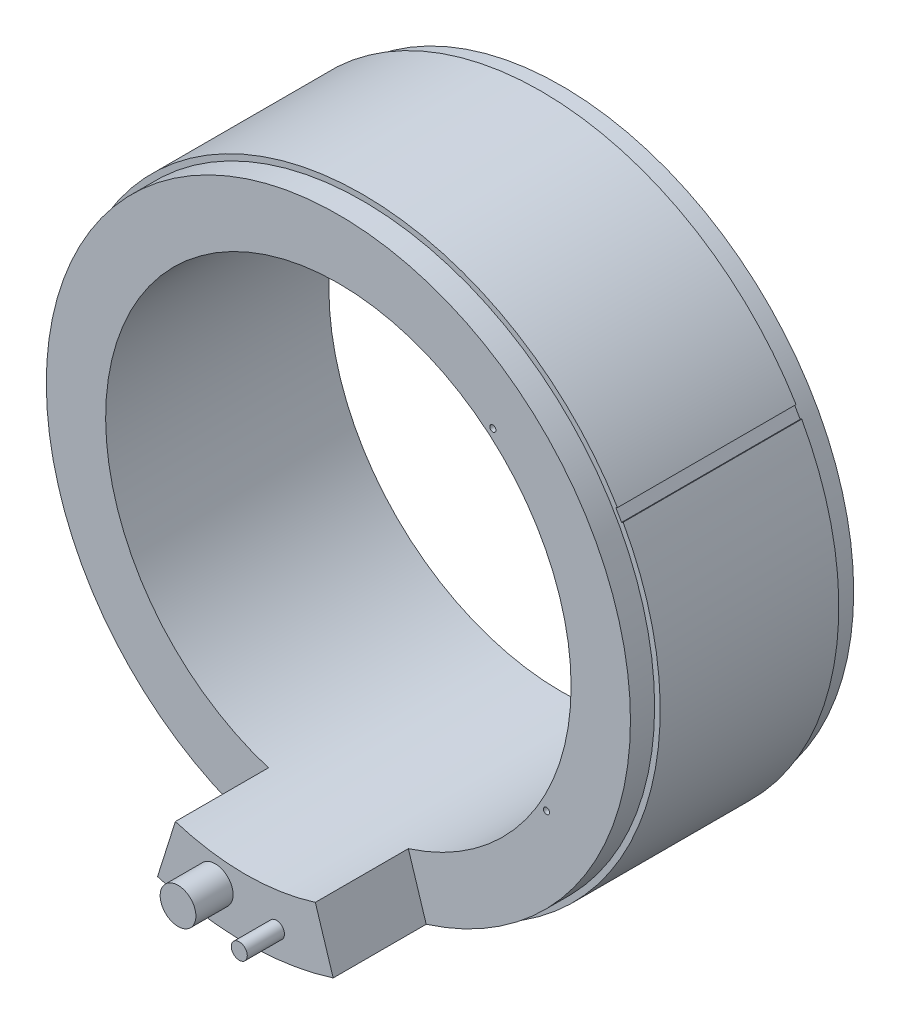
ISO-10303-21;
HEADER;
FILE_DESCRIPTION(('STEP AP214'),'2;1');
FILE_NAME('part.step','',(''),(''),'','','');
FILE_SCHEMA(('AUTOMOTIVE_DESIGN { 1 0 10303 214 1 1 1 1 }'));
ENDSEC;
DATA;
#1=APPLICATION_CONTEXT('core data for automotive mechanical design processes');
#2=APPLICATION_PROTOCOL_DEFINITION('international standard','automotive_design',2000,#1);
#3=PRODUCT_CONTEXT('',#1,'mechanical');
#4=PRODUCT('Part','Part','',(#3));
#5=PRODUCT_RELATED_PRODUCT_CATEGORY('part','',(#4));
#6=PRODUCT_DEFINITION_FORMATION('','',#4);
#7=PRODUCT_DEFINITION_CONTEXT('part definition',#1,'design');
#8=PRODUCT_DEFINITION('design','',#6,#7);
#9=PRODUCT_DEFINITION_SHAPE('','',#8);
#10=(LENGTH_UNIT() NAMED_UNIT(*) SI_UNIT(.MILLI.,.METRE.));
#11=(NAMED_UNIT(*) PLANE_ANGLE_UNIT() SI_UNIT($,.RADIAN.));
#12=(NAMED_UNIT(*) SI_UNIT($,.STERADIAN.) SOLID_ANGLE_UNIT());
#13=UNCERTAINTY_MEASURE_WITH_UNIT(LENGTH_MEASURE(1.E-05),#10,'distance_accuracy_value','');
#14=(GEOMETRIC_REPRESENTATION_CONTEXT(3) GLOBAL_UNCERTAINTY_ASSIGNED_CONTEXT((#13)) GLOBAL_UNIT_ASSIGNED_CONTEXT((#10,
#11,#12)) REPRESENTATION_CONTEXT('',''));
#15=CARTESIAN_POINT('',(0.,0.,0.));
#16=DIRECTION('',(0.,0.,1.));
#17=DIRECTION('',(1.,0.,0.));
#18=AXIS2_PLACEMENT_3D('',#15,#16,#17);
#19=CARTESIAN_POINT('',(-8.09694915469374,-68.9260430779709,164.));
#20=DIRECTION('',(0.,0.,-1.));
#21=DIRECTION('',(-1.,0.,0.));
#22=AXIS2_PLACEMENT_3D('',#19,#20,#21);
#23=CYLINDRICAL_SURFACE('',#22,4.8);
#24=CARTESIAN_POINT('',(-8.09694915469374,-68.9260430779709,85.));
#25=DIRECTION('',(0.,0.,-1.));
#26=DIRECTION('',(-1.,0.,0.));
#27=AXIS2_PLACEMENT_3D('',#24,#25,#26);
#28=CIRCLE('',#27,4.8);
#29=CARTESIAN_POINT('',(-12.8969491546937,-68.9260430779709,85.));
#30=VERTEX_POINT('',#29);
#31=EDGE_CURVE('E452',#30,#30,#28,.T.);
#32=ORIENTED_EDGE('',*,*,#31,.F.);
#33=EDGE_LOOP('',(#32));
#34=FACE_BOUND('',#33,.T.);
#35=CARTESIAN_POINT('',(-8.09694915469374,-68.9260430779709,95.));
#36=DIRECTION('',(0.,0.,1.));
#37=DIRECTION('',(1.,0.,0.));
#38=AXIS2_PLACEMENT_3D('',#35,#36,#37);
#39=CIRCLE('',#38,4.80000000000001);
#40=CARTESIAN_POINT('',(-3.29694915469373,-68.9260430779709,95.));
#41=VERTEX_POINT('',#40);
#42=EDGE_CURVE('E878',#41,#41,#39,.T.);
#43=ORIENTED_EDGE('',*,*,#42,.F.);
#44=EDGE_LOOP('',(#43));
#45=FACE_BOUND('',#44,.T.);
#46=ADVANCED_FACE('F64',(#34,#45),#23,.T.);
#47=CARTESIAN_POINT('',(8.36529185002222,-71.2103355719094,164.));
#48=DIRECTION('',(0.,0.,-1.));
#49=DIRECTION('',(-1.,0.,0.));
#50=AXIS2_PLACEMENT_3D('',#47,#48,#49);
#51=CYLINDRICAL_SURFACE('',#50,2.15);
#52=CARTESIAN_POINT('',(8.36529185002222,-71.2103355719094,85.));
#53=DIRECTION('',(0.,0.,-1.));
#54=DIRECTION('',(-1.,0.,0.));
#55=AXIS2_PLACEMENT_3D('',#52,#53,#54);
#56=CIRCLE('',#55,2.15);
#57=CARTESIAN_POINT('',(6.21529185002222,-71.2103355719094,85.));
#58=VERTEX_POINT('',#57);
#59=EDGE_CURVE('E448',#58,#58,#56,.T.);
#60=ORIENTED_EDGE('',*,*,#59,.F.);
#61=EDGE_LOOP('',(#60));
#62=FACE_BOUND('',#61,.T.);
#63=CARTESIAN_POINT('',(8.36529185002222,-71.2103355719094,95.));
#64=DIRECTION('',(0.,0.,1.));
#65=DIRECTION('',(1.,0.,0.));
#66=AXIS2_PLACEMENT_3D('',#63,#64,#65);
#67=CIRCLE('',#66,2.14999999999999);
#68=CARTESIAN_POINT('',(10.5152918500222,-71.2103355719094,95.));
#69=VERTEX_POINT('',#68);
#70=EDGE_CURVE('E495',#69,#69,#67,.T.);
#71=ORIENTED_EDGE('',*,*,#70,.F.);
#72=EDGE_LOOP('',(#71));
#73=FACE_BOUND('',#72,.T.);
#74=ADVANCED_FACE('F536',(#62,#73),#51,.T.);
#75=CARTESIAN_POINT('',(41.5240795857504,49.486471025486,54.));
#76=DIRECTION('',(0.,0.,1.));
#77=DIRECTION('',(0.,1.,0.));
#78=AXIS2_PLACEMENT_3D('',#75,#76,#77);
#79=CONICAL_SURFACE('',#78,0.825,1.02974425867665);
#80=CARTESIAN_POINT('',(41.5240795857504,49.486471025486,53.5042899893023));
#81=VERTEX_POINT('',#80);
#82=VERTEX_LOOP('',#81);
#83=FACE_BOUND('',#82,.T.);
#84=CARTESIAN_POINT('',(41.5240795857504,49.486471025486,54.));
#85=DIRECTION('',(0.,0.,-1.));
#86=DIRECTION('',(0.,1.,0.));
#87=AXIS2_PLACEMENT_3D('',#84,#85,#86);
#88=CIRCLE('',#87,0.825);
#89=CARTESIAN_POINT('',(41.5240795857504,50.311471025486,54.));
#90=VERTEX_POINT('',#89);
#91=EDGE_CURVE('E11',#90,#90,#88,.T.);
#92=ORIENTED_EDGE('',*,*,#91,.F.);
#93=EDGE_LOOP('',(#92));
#94=FACE_BOUND('',#93,.T.);
#95=ADVANCED_FACE('F66',(#83,#94),#79,.F.);
#96=CARTESIAN_POINT('',(41.5240795857504,49.486471025486,60.));
#97=DIRECTION('',(0.,0.,-1.));
#98=DIRECTION('',(0.,-1.,0.));
#99=AXIS2_PLACEMENT_3D('',#96,#97,#98);
#100=CYLINDRICAL_SURFACE('',#99,0.825);
#101=CARTESIAN_POINT('',(41.5240795857504,49.486471025486,60.));
#102=DIRECTION('',(0.,0.,-1.));
#103=DIRECTION('',(0.,-1.,0.));
#104=AXIS2_PLACEMENT_3D('',#101,#102,#103);
#105=CIRCLE('',#104,0.825);
#106=CARTESIAN_POINT('',(41.5240795857504,48.661471025486,60.));
#107=VERTEX_POINT('',#106);
#108=EDGE_CURVE('E357',#107,#107,#105,.T.);
#109=ORIENTED_EDGE('',*,*,#108,.F.);
#110=EDGE_LOOP('',(#109));
#111=FACE_BOUND('',#110,.T.);
#112=ORIENTED_EDGE('',*,*,#91,.T.);
#113=EDGE_LOOP('',(#112));
#114=FACE_BOUND('',#113,.T.);
#115=ADVANCED_FACE('F262',(#111,#114),#100,.F.);
#116=CARTESIAN_POINT('',(55.9452410844747,-32.3,54.));
#117=DIRECTION('',(0.,0.,1.));
#118=DIRECTION('',(0.,1.,0.));
#119=AXIS2_PLACEMENT_3D('',#116,#117,#118);
#120=CONICAL_SURFACE('',#119,0.825,1.02974425867665);
#121=CARTESIAN_POINT('',(55.9452410844747,-32.3,53.5042899893023));
#122=VERTEX_POINT('',#121);
#123=VERTEX_LOOP('',#122);
#124=FACE_BOUND('',#123,.T.);
#125=CARTESIAN_POINT('',(55.9452410844747,-32.3,54.));
#126=DIRECTION('',(0.,0.,-1.));
#127=DIRECTION('',(0.,1.,0.));
#128=AXIS2_PLACEMENT_3D('',#125,#126,#127);
#129=CIRCLE('',#128,0.825);
#130=CARTESIAN_POINT('',(55.9452410844747,-31.475,54.));
#131=VERTEX_POINT('',#130);
#132=EDGE_CURVE('E68',#131,#131,#129,.T.);
#133=ORIENTED_EDGE('',*,*,#132,.F.);
#134=EDGE_LOOP('',(#133));
#135=FACE_BOUND('',#134,.T.);
#136=ADVANCED_FACE('F258',(#124,#135),#120,.F.);
#137=CARTESIAN_POINT('',(55.9452410844747,-32.3,60.));
#138=DIRECTION('',(0.,0.,-1.));
#139=DIRECTION('',(0.,-1.,0.));
#140=AXIS2_PLACEMENT_3D('',#137,#138,#139);
#141=CYLINDRICAL_SURFACE('',#140,0.825);
#142=CARTESIAN_POINT('',(55.9452410844747,-32.3,60.));
#143=DIRECTION('',(0.,0.,-1.));
#144=DIRECTION('',(0.,-1.,0.));
#145=AXIS2_PLACEMENT_3D('',#142,#143,#144);
#146=CIRCLE('',#145,0.825);
#147=CARTESIAN_POINT('',(55.9452410844747,-33.125,60.));
#148=VERTEX_POINT('',#147);
#149=EDGE_CURVE('E394',#148,#148,#146,.T.);
#150=ORIENTED_EDGE('',*,*,#149,.F.);
#151=EDGE_LOOP('',(#150));
#152=FACE_BOUND('',#151,.T.);
#153=ORIENTED_EDGE('',*,*,#132,.T.);
#154=EDGE_LOOP('',(#153));
#155=FACE_BOUND('',#154,.T.);
#156=ADVANCED_FACE('F261',(#152,#155),#141,.F.);
#157=CARTESIAN_POINT('',(68.0865196008629,41.0706887407713,-188.203026023034));
#158=DIRECTION('',(0.5,-0.866025403784439,0.));
#159=DIRECTION('',(0.,0.,-1.));
#160=AXIS2_PLACEMENT_3D('',#157,#158,#159);
#161=PLANE('',#160);
#162=DIRECTION('',(0.,0.,1.));
#163=VECTOR('',#162,1.);
#164=CARTESIAN_POINT('',(68.5069433444502,41.3134205023052,-188.203026023034));
#165=LINE('',#164,#163);
#166=CARTESIAN_POINT('',(68.5069433444502,41.3134205023052,5.5));
#167=VERTEX_POINT('',#166);
#168=CARTESIAN_POINT('',(68.5069433444502,41.3134205023052,53.5));
#169=VERTEX_POINT('',#168);
#170=EDGE_CURVE('E364',#167,#169,#165,.T.);
#171=ORIENTED_EDGE('',*,*,#170,.T.);
#172=DIRECTION('',(0.866025403784439,0.5,0.));
#173=VECTOR('',#172,1.);
#174=CARTESIAN_POINT('',(68.0865196008629,41.0706887407713,53.5));
#175=LINE('',#174,#173);
#176=CARTESIAN_POINT('',(68.0865196008629,41.0706887407713,53.5));
#177=VERTEX_POINT('',#176);
#178=EDGE_CURVE('E328',#177,#169,#175,.T.);
#179=ORIENTED_EDGE('',*,*,#178,.F.);
#180=DIRECTION('',(0.,0.,1.));
#181=VECTOR('',#180,1.);
#182=CARTESIAN_POINT('',(68.0865196008629,41.0706887407713,-188.203026023034));
#183=LINE('',#182,#181);
#184=CARTESIAN_POINT('',(68.0865196008629,41.0706887407713,5.5));
#185=VERTEX_POINT('',#184);
#186=EDGE_CURVE('E264',#185,#177,#183,.T.);
#187=ORIENTED_EDGE('',*,*,#186,.F.);
#188=DIRECTION('',(-0.866025403784439,-0.5,0.));
#189=VECTOR('',#188,1.);
#190=CARTESIAN_POINT('',(59.2375,35.9617048921489,5.5));
#191=LINE('',#190,#189);
#192=EDGE_CURVE('E415',#167,#185,#191,.T.);
#193=ORIENTED_EDGE('',*,*,#192,.F.);
#194=EDGE_LOOP('',(#171,#179,#187,#193));
#195=FACE_BOUND('',#194,.T.);
#196=ADVANCED_FACE('F516',(#195),#161,.T.);
#197=CARTESIAN_POINT('',(69.6115196008629,38.4293112592288,-188.203026023034));
#198=DIRECTION('',(0.866025403784438,0.5,0.));
#199=DIRECTION('',(0.,0.,-1.));
#200=AXIS2_PLACEMENT_3D('',#197,#198,#199);
#201=PLANE('',#200);
#202=ORIENTED_EDGE('',*,*,#186,.T.);
#203=DIRECTION('',(-0.5,0.866025403784438,0.));
#204=VECTOR('',#203,1.);
#205=CARTESIAN_POINT('',(69.6115196008629,38.4293112592288,53.5));
#206=LINE('',#205,#204);
#207=CARTESIAN_POINT('',(69.6115196008629,38.4293112592288,53.5));
#208=VERTEX_POINT('',#207);
#209=EDGE_CURVE('E331',#208,#177,#206,.T.);
#210=ORIENTED_EDGE('',*,*,#209,.F.);
#211=DIRECTION('',(0.,0.,1.));
#212=VECTOR('',#211,1.);
#213=CARTESIAN_POINT('',(69.6115196008629,38.4293112592288,-188.203026023034));
#214=LINE('',#213,#212);
#215=CARTESIAN_POINT('',(69.6115196008629,38.4293112592288,5.5));
#216=VERTEX_POINT('',#215);
#217=EDGE_CURVE('E269',#216,#208,#214,.T.);
#218=ORIENTED_EDGE('',*,*,#217,.F.);
#219=DIRECTION('',(0.5,-0.866025403784438,0.));
#220=VECTOR('',#219,1.);
#221=CARTESIAN_POINT('',(88.8490196008629,5.10898384862248,5.5));
#222=LINE('',#221,#220);
#223=EDGE_CURVE('E377',#185,#216,#222,.T.);
#224=ORIENTED_EDGE('',*,*,#223,.F.);
#225=EDGE_LOOP('',(#202,#210,#218,#224));
#226=FACE_BOUND('',#225,.T.);
#227=ADVANCED_FACE('F507',(#226),#201,.T.);
#228=CARTESIAN_POINT('',(70.0319433444502,38.6720430207627,-188.203026023034));
#229=DIRECTION('',(-0.5,0.866025403784438,0.));
#230=DIRECTION('',(0.,0.,1.));
#231=AXIS2_PLACEMENT_3D('',#228,#229,#230);
#232=PLANE('',#231);
#233=ORIENTED_EDGE('',*,*,#217,.T.);
#234=DIRECTION('',(-0.866025403784438,-0.5,0.));
#235=VECTOR('',#234,1.);
#236=CARTESIAN_POINT('',(70.0319433444502,38.6720430207627,53.5));
#237=LINE('',#236,#235);
#238=CARTESIAN_POINT('',(70.0319433444502,38.6720430207627,53.5));
#239=VERTEX_POINT('',#238);
#240=EDGE_CURVE('E500',#239,#208,#237,.T.);
#241=ORIENTED_EDGE('',*,*,#240,.F.);
#242=DIRECTION('',(0.,0.,1.));
#243=VECTOR('',#242,1.);
#244=CARTESIAN_POINT('',(70.0319433444502,38.6720430207627,-188.203026023034));
#245=LINE('',#244,#243);
#246=CARTESIAN_POINT('',(70.0319433444502,38.6720430207627,5.5));
#247=VERTEX_POINT('',#246);
#248=EDGE_CURVE('E349',#247,#239,#245,.T.);
#249=ORIENTED_EDGE('',*,*,#248,.F.);
#250=DIRECTION('',(0.866025403784438,0.5,0.));
#251=VECTOR('',#250,1.);
#252=CARTESIAN_POINT('',(60.7625,33.3203274106063,5.5));
#253=LINE('',#252,#251);
#254=EDGE_CURVE('E373',#216,#247,#253,.T.);
#255=ORIENTED_EDGE('',*,*,#254,.F.);
#256=EDGE_LOOP('',(#233,#241,#249,#255));
#257=FACE_BOUND('',#256,.T.);
#258=ADVANCED_FACE('F511',(#257),#232,.T.);
#259=CARTESIAN_POINT('',(-69.6115196008629,38.4293112592287,-188.203026023034));
#260=DIRECTION('',(0.5,0.866025403784438,0.));
#261=DIRECTION('',(0.,0.,-1.));
#262=AXIS2_PLACEMENT_3D('',#259,#260,#261);
#263=PLANE('',#262);
#264=DIRECTION('',(0.,0.,1.));
#265=VECTOR('',#264,1.);
#266=CARTESIAN_POINT('',(-70.0319433444502,38.6720430207626,-188.203026023034));
#267=LINE('',#266,#265);
#268=CARTESIAN_POINT('',(-70.0319433444502,38.6720430207626,5.5));
#269=VERTEX_POINT('',#268);
#270=CARTESIAN_POINT('',(-70.0319433444502,38.6720430207626,53.5));
#271=VERTEX_POINT('',#270);
#272=EDGE_CURVE('E303',#269,#271,#267,.T.);
#273=ORIENTED_EDGE('',*,*,#272,.T.);
#274=DIRECTION('',(-0.866025403784438,0.5,0.));
#275=VECTOR('',#274,1.);
#276=CARTESIAN_POINT('',(-69.6115196008629,38.4293112592287,53.5));
#277=LINE('',#276,#275);
#278=CARTESIAN_POINT('',(-69.6115196008629,38.4293112592287,53.5));
#279=VERTEX_POINT('',#278);
#280=EDGE_CURVE('E301',#279,#271,#277,.T.);
#281=ORIENTED_EDGE('',*,*,#280,.F.);
#282=DIRECTION('',(0.,0.,1.));
#283=VECTOR('',#282,1.);
#284=CARTESIAN_POINT('',(-69.6115196008629,38.4293112592287,-188.203026023034));
#285=LINE('',#284,#283);
#286=CARTESIAN_POINT('',(-69.6115196008629,38.4293112592287,5.5));
#287=VERTEX_POINT('',#286);
#288=EDGE_CURVE('E278',#287,#279,#285,.T.);
#289=ORIENTED_EDGE('',*,*,#288,.F.);
#290=DIRECTION('',(0.866025403784438,-0.5,0.));
#291=VECTOR('',#290,1.);
#292=CARTESIAN_POINT('',(59.2375,-35.961704892149,5.5));
#293=LINE('',#292,#291);
#294=EDGE_CURVE('E405',#269,#287,#293,.T.);
#295=ORIENTED_EDGE('',*,*,#294,.F.);
#296=EDGE_LOOP('',(#273,#281,#289,#295));
#297=FACE_BOUND('',#296,.T.);
#298=ADVANCED_FACE('F302',(#297),#263,.T.);
#299=CARTESIAN_POINT('',(-68.0865196008629,41.0706887407713,-188.203026023034));
#300=DIRECTION('',(-0.866025403784439,0.5,0.));
#301=DIRECTION('',(0.,0.,1.));
#302=AXIS2_PLACEMENT_3D('',#299,#300,#301);
#303=PLANE('',#302);
#304=ORIENTED_EDGE('',*,*,#288,.T.);
#305=DIRECTION('',(-0.5,-0.866025403784439,0.));
#306=VECTOR('',#305,1.);
#307=CARTESIAN_POINT('',(-68.0865196008629,41.0706887407713,53.5));
#308=LINE('',#307,#306);
#309=CARTESIAN_POINT('',(-68.0865196008629,41.0706887407713,53.5));
#310=VERTEX_POINT('',#309);
#311=EDGE_CURVE('E293',#310,#279,#308,.T.);
#312=ORIENTED_EDGE('',*,*,#311,.F.);
#313=DIRECTION('',(0.,0.,1.));
#314=VECTOR('',#313,1.);
#315=CARTESIAN_POINT('',(-68.0865196008629,41.0706887407713,-188.203026023034));
#316=LINE('',#315,#314);
#317=CARTESIAN_POINT('',(-68.0865196008629,41.0706887407713,5.5));
#318=VERTEX_POINT('',#317);
#319=EDGE_CURVE('E283',#318,#310,#316,.T.);
#320=ORIENTED_EDGE('',*,*,#319,.F.);
#321=DIRECTION('',(0.5,0.866025403784439,0.));
#322=VECTOR('',#321,1.);
#323=CARTESIAN_POINT('',(-48.8490196008629,74.3910161513775,5.5));
#324=LINE('',#323,#322);
#325=EDGE_CURVE('E296',#287,#318,#324,.T.);
#326=ORIENTED_EDGE('',*,*,#325,.F.);
#327=EDGE_LOOP('',(#304,#312,#320,#326));
#328=FACE_BOUND('',#327,.T.);
#329=ADVANCED_FACE('F291',(#328),#303,.T.);
#330=CARTESIAN_POINT('',(-68.5069433444502,41.3134205023051,-188.203026023034));
#331=DIRECTION('',(-0.5,-0.866025403784439,0.));
#332=DIRECTION('',(-0.866025403784439,0.5,0.));
#333=AXIS2_PLACEMENT_3D('',#330,#331,#332);
#334=PLANE('',#333);
#335=ORIENTED_EDGE('',*,*,#319,.T.);
#336=DIRECTION('',(0.866025403784439,-0.5,0.));
#337=VECTOR('',#336,1.);
#338=CARTESIAN_POINT('',(-68.5069433444502,41.3134205023051,53.5));
#339=LINE('',#338,#337);
#340=CARTESIAN_POINT('',(-68.5069433444502,41.3134205023051,53.5));
#341=VERTEX_POINT('',#340);
#342=EDGE_CURVE('E315',#341,#310,#339,.T.);
#343=ORIENTED_EDGE('',*,*,#342,.F.);
#344=DIRECTION('',(0.,0.,1.));
#345=VECTOR('',#344,1.);
#346=CARTESIAN_POINT('',(-68.5069433444502,41.3134205023051,-188.203026023034));
#347=LINE('',#346,#345);
#348=CARTESIAN_POINT('',(-68.5069433444502,41.3134205023051,5.5));
#349=VERTEX_POINT('',#348);
#350=EDGE_CURVE('E381',#349,#341,#347,.T.);
#351=ORIENTED_EDGE('',*,*,#350,.F.);
#352=DIRECTION('',(-0.866025403784439,0.5,0.));
#353=VECTOR('',#352,1.);
#354=CARTESIAN_POINT('',(60.7625,-33.3203274106063,5.5));
#355=LINE('',#354,#353);
#356=EDGE_CURVE('E412',#318,#349,#355,.T.);
#357=ORIENTED_EDGE('',*,*,#356,.F.);
#358=EDGE_LOOP('',(#335,#343,#351,#357));
#359=FACE_BOUND('',#358,.T.);
#360=ADVANCED_FACE('F523',(#359),#334,.T.);
#361=CARTESIAN_POINT('',(1.525,-79.5,-188.212648096869));
#362=DIRECTION('',(-1.,0.,0.));
#363=DIRECTION('',(0.,0.,1.));
#364=AXIS2_PLACEMENT_3D('',#361,#362,#363);
#365=PLANE('',#364);
#366=DIRECTION('',(0.,0.,1.));
#367=VECTOR('',#366,1.);
#368=CARTESIAN_POINT('',(1.525,-79.9854635230678,-188.212648096869));
#369=LINE('',#368,#367);
#370=CARTESIAN_POINT('',(1.525,-79.9854635230678,5.5));
#371=VERTEX_POINT('',#370);
#372=CARTESIAN_POINT('',(1.525,-79.9854635230678,53.5));
#373=VERTEX_POINT('',#372);
#374=EDGE_CURVE('E352',#371,#373,#369,.T.);
#375=ORIENTED_EDGE('',*,*,#374,.T.);
#376=DIRECTION('',(0.,-1.,0.));
#377=VECTOR('',#376,1.);
#378=CARTESIAN_POINT('',(1.525,-79.5,53.5));
#379=LINE('',#378,#377);
#380=CARTESIAN_POINT('',(1.525,-79.5,53.5));
#381=VERTEX_POINT('',#380);
#382=EDGE_CURVE('E338',#381,#373,#379,.T.);
#383=ORIENTED_EDGE('',*,*,#382,.F.);
#384=DIRECTION('',(0.,0.,1.));
#385=VECTOR('',#384,1.);
#386=CARTESIAN_POINT('',(1.525,-79.5,-188.212648096869));
#387=LINE('',#386,#385);
#388=CARTESIAN_POINT('',(1.525,-79.5,5.5));
#389=VERTEX_POINT('',#388);
#390=EDGE_CURVE('E281',#389,#381,#387,.T.);
#391=ORIENTED_EDGE('',*,*,#390,.F.);
#392=DIRECTION('',(0.,1.,0.));
#393=VECTOR('',#392,1.);
#394=CARTESIAN_POINT('',(1.52500000000014,1.40208706018769E-13,5.5));
#395=LINE('',#394,#393);
#396=EDGE_CURVE('E376',#371,#389,#395,.T.);
#397=ORIENTED_EDGE('',*,*,#396,.F.);
#398=EDGE_LOOP('',(#375,#383,#391,#397));
#399=FACE_BOUND('',#398,.T.);
#400=ADVANCED_FACE('F474',(#399),#365,.T.);
#401=CARTESIAN_POINT('',(-1.525,-79.5,-188.212648096869));
#402=DIRECTION('',(0.,-1.,0.));
#403=DIRECTION('',(0.,0.,-1.));
#404=AXIS2_PLACEMENT_3D('',#401,#402,#403);
#405=PLANE('',#404);
#406=ORIENTED_EDGE('',*,*,#390,.T.);
#407=DIRECTION('',(1.,0.,0.));
#408=VECTOR('',#407,1.);
#409=CARTESIAN_POINT('',(-1.525,-79.5,53.5));
#410=LINE('',#409,#408);
#411=CARTESIAN_POINT('',(-1.525,-79.5,53.5));
#412=VERTEX_POINT('',#411);
#413=EDGE_CURVE('E334',#412,#381,#410,.T.);
#414=ORIENTED_EDGE('',*,*,#413,.F.);
#415=DIRECTION('',(0.,0.,1.));
#416=VECTOR('',#415,1.);
#417=CARTESIAN_POINT('',(-1.525,-79.5,-188.212648096869));
#418=LINE('',#417,#416);
#419=CARTESIAN_POINT('',(-1.525,-79.5,5.5));
#420=VERTEX_POINT('',#419);
#421=EDGE_CURVE('E451',#420,#412,#418,.T.);
#422=ORIENTED_EDGE('',*,*,#421,.F.);
#423=DIRECTION('',(-1.,0.,0.));
#424=VECTOR('',#423,1.);
#425=CARTESIAN_POINT('',(80.,-79.5,5.5));
#426=LINE('',#425,#424);
#427=EDGE_CURVE('E393',#389,#420,#426,.T.);
#428=ORIENTED_EDGE('',*,*,#427,.F.);
#429=EDGE_LOOP('',(#406,#414,#422,#428));
#430=FACE_BOUND('',#429,.T.);
#431=ADVANCED_FACE('F472',(#430),#405,.T.);
#432=CARTESIAN_POINT('',(-1.525,-79.9854635230678,-188.212648096869));
#433=DIRECTION('',(1.,0.,0.));
#434=DIRECTION('',(0.,1.,0.));
#435=AXIS2_PLACEMENT_3D('',#432,#433,#434);
#436=PLANE('',#435);
#437=ORIENTED_EDGE('',*,*,#421,.T.);
#438=DIRECTION('',(0.,1.,0.));
#439=VECTOR('',#438,1.);
#440=CARTESIAN_POINT('',(-1.525,-79.9854635230678,53.5));
#441=LINE('',#440,#439);
#442=CARTESIAN_POINT('',(-1.525,-79.9854635230678,53.5));
#443=VERTEX_POINT('',#442);
#444=EDGE_CURVE('E339',#443,#412,#441,.T.);
#445=ORIENTED_EDGE('',*,*,#444,.F.);
#446=DIRECTION('',(0.,0.,1.));
#447=VECTOR('',#446,1.);
#448=CARTESIAN_POINT('',(-1.525,-79.9854635230678,-188.212648096869));
#449=LINE('',#448,#447);
#450=CARTESIAN_POINT('',(-1.525,-79.9854635230678,5.5));
#451=VERTEX_POINT('',#450);
#452=EDGE_CURVE('E416',#451,#443,#449,.T.);
#453=ORIENTED_EDGE('',*,*,#452,.F.);
#454=DIRECTION('',(0.,-1.,0.));
#455=VECTOR('',#454,1.);
#456=CARTESIAN_POINT('',(-1.525,0.,5.5));
#457=LINE('',#456,#455);
#458=EDGE_CURVE('E400',#420,#451,#457,.T.);
#459=ORIENTED_EDGE('',*,*,#458,.F.);
#460=EDGE_LOOP('',(#437,#445,#453,#459));
#461=FACE_BOUND('',#460,.T.);
#462=ADVANCED_FACE('F477',(#461),#436,.T.);
#463=CARTESIAN_POINT('',(0.,0.,85.));
#464=DIRECTION('',(0.,0.,-1.));
#465=DIRECTION('',(0.,-1.,0.));
#466=AXIS2_PLACEMENT_3D('',#463,#464,#465);
#467=PLANE('',#466);
#468=CARTESIAN_POINT('',(0.,0.,85.));
#469=DIRECTION('',(0.,0.,-1.));
#470=DIRECTION('',(1.,0.,0.));
#471=AXIS2_PLACEMENT_3D('',#468,#469,#470);
#472=CIRCLE('',#471,62.55);
#473=CARTESIAN_POINT('',(18.8091477589923,-59.6549952693016,85.));
#474=VERTEX_POINT('',#473);
#475=CARTESIAN_POINT('',(-18.8091477589923,-59.6549952693016,85.));
#476=VERTEX_POINT('',#475);
#477=EDGE_CURVE('E358',#474,#476,#472,.T.);
#478=ORIENTED_EDGE('',*,*,#477,.T.);
#479=DIRECTION('',(-0.300705799504273,-0.953716950748227,0.));
#480=VECTOR('',#479,1.);
#481=CARTESIAN_POINT('',(-18.8091477589923,-59.6549952693016,85.));
#482=LINE('',#481,#480);
#483=CARTESIAN_POINT('',(-23.6054052610854,-74.8667806337358,85.));
#484=VERTEX_POINT('',#483);
#485=EDGE_CURVE('E459',#476,#484,#482,.T.);
#486=ORIENTED_EDGE('',*,*,#485,.T.);
#487=CARTESIAN_POINT('',(0.,0.,85.));
#488=DIRECTION('',(0.,0.,1.));
#489=DIRECTION('',(1.,0.,0.));
#490=AXIS2_PLACEMENT_3D('',#487,#488,#489);
#491=CIRCLE('',#490,78.5);
#492=CARTESIAN_POINT('',(23.6054052610854,-74.8667806337358,85.));
#493=VERTEX_POINT('',#492);
#494=EDGE_CURVE('E368',#484,#493,#491,.T.);
#495=ORIENTED_EDGE('',*,*,#494,.T.);
#496=DIRECTION('',(-0.300705799504274,0.953716950748227,0.));
#497=VECTOR('',#496,1.);
#498=CARTESIAN_POINT('',(18.8091477589923,-59.6549952693016,85.));
#499=LINE('',#498,#497);
#500=EDGE_CURVE('E460',#493,#474,#499,.T.);
#501=ORIENTED_EDGE('',*,*,#500,.T.);
#502=EDGE_LOOP('',(#478,#486,#495,#501));
#503=FACE_BOUND('',#502,.T.);
#504=ORIENTED_EDGE('',*,*,#59,.T.);
#505=EDGE_LOOP('',(#504));
#506=FACE_BOUND('',#505,.T.);
#507=ORIENTED_EDGE('',*,*,#31,.T.);
#508=EDGE_LOOP('',(#507));
#509=FACE_BOUND('',#508,.T.);
#510=ADVANCED_FACE('F600',(#503,#506,#509),#467,.F.);
#511=CARTESIAN_POINT('',(18.8091477589923,-59.6549952693016,85.));
#512=DIRECTION('',(-0.953716950748227,-0.300705799504274,0.));
#513=DIRECTION('',(-0.300705799504274,0.953716950748227,0.));
#514=AXIS2_PLACEMENT_3D('',#511,#512,#513);
#515=PLANE('',#514);
#516=DIRECTION('',(-0.300705799504274,0.953716950748227,0.));
#517=VECTOR('',#516,1.);
#518=CARTESIAN_POINT('',(18.8091477589923,-59.6549952693016,60.));
#519=LINE('',#518,#517);
#520=CARTESIAN_POINT('',(23.6054052610854,-74.8667806337358,60.));
#521=VERTEX_POINT('',#520);
#522=CARTESIAN_POINT('',(18.8091477589923,-59.6549952693016,60.));
#523=VERTEX_POINT('',#522);
#524=EDGE_CURVE('E326',#521,#523,#519,.T.);
#525=ORIENTED_EDGE('',*,*,#524,.T.);
#526=DIRECTION('',(0.,0.,-1.));
#527=VECTOR('',#526,1.);
#528=CARTESIAN_POINT('',(18.8091477589923,-59.6549952693016,85.));
#529=LINE('',#528,#527);
#530=EDGE_CURVE('E353',#474,#523,#529,.T.);
#531=ORIENTED_EDGE('',*,*,#530,.F.);
#532=ORIENTED_EDGE('',*,*,#500,.F.);
#533=DIRECTION('',(0.,0.,-1.));
#534=VECTOR('',#533,1.);
#535=CARTESIAN_POINT('',(23.6054052610854,-74.8667806337358,85.));
#536=LINE('',#535,#534);
#537=EDGE_CURVE('E365',#493,#521,#536,.T.);
#538=ORIENTED_EDGE('',*,*,#537,.T.);
#539=EDGE_LOOP('',(#525,#531,#532,#538));
#540=FACE_BOUND('',#539,.T.);
#541=ADVANCED_FACE('F596',(#540),#515,.F.);
#542=CARTESIAN_POINT('',(-18.8091477589923,-59.6549952693016,85.));
#543=DIRECTION('',(0.953716950748227,-0.300705799504273,0.));
#544=DIRECTION('',(0.,0.,-1.));
#545=AXIS2_PLACEMENT_3D('',#542,#543,#544);
#546=PLANE('',#545);
#547=DIRECTION('',(-0.300705799504273,-0.953716950748227,0.));
#548=VECTOR('',#547,1.);
#549=CARTESIAN_POINT('',(-18.8091477589923,-59.6549952693016,60.));
#550=LINE('',#549,#548);
#551=CARTESIAN_POINT('',(-18.8091477589923,-59.6549952693016,60.));
#552=VERTEX_POINT('',#551);
#553=CARTESIAN_POINT('',(-23.6054052610854,-74.8667806337358,60.));
#554=VERTEX_POINT('',#553);
#555=EDGE_CURVE('E369',#552,#554,#550,.T.);
#556=ORIENTED_EDGE('',*,*,#555,.T.);
#557=DIRECTION('',(0.,0.,-1.));
#558=VECTOR('',#557,1.);
#559=CARTESIAN_POINT('',(-23.6054052610854,-74.8667806337358,85.));
#560=LINE('',#559,#558);
#561=EDGE_CURVE('E456',#484,#554,#560,.T.);
#562=ORIENTED_EDGE('',*,*,#561,.F.);
#563=ORIENTED_EDGE('',*,*,#485,.F.);
#564=DIRECTION('',(0.,0.,-1.));
#565=VECTOR('',#564,1.);
#566=CARTESIAN_POINT('',(-18.8091477589923,-59.6549952693016,85.));
#567=LINE('',#566,#565);
#568=EDGE_CURVE('E434',#476,#552,#567,.T.);
#569=ORIENTED_EDGE('',*,*,#568,.T.);
#570=EDGE_LOOP('',(#556,#562,#563,#569));
#571=FACE_BOUND('',#570,.T.);
#572=ADVANCED_FACE('F592',(#571),#546,.F.);
#573=CARTESIAN_POINT('',(0.,0.,54.));
#574=DIRECTION('',(0.,0.,1.));
#575=DIRECTION('',(1.,0.,0.));
#576=AXIS2_PLACEMENT_3D('',#573,#574,#575);
#577=CYLINDRICAL_SURFACE('',#576,78.5);
#578=CARTESIAN_POINT('',(0.,0.,5.5));
#579=DIRECTION('',(0.,0.,1.));
#580=DIRECTION('',(1.,0.,0.));
#581=AXIS2_PLACEMENT_3D('',#578,#579,#580);
#582=CIRCLE('',#581,78.5);
#583=CARTESIAN_POINT('',(78.5,0.,5.5));
#584=VERTEX_POINT('',#583);
#585=EDGE_CURVE('E384',#584,#584,#582,.T.);
#586=ORIENTED_EDGE('',*,*,#585,.F.);
#587=EDGE_LOOP('',(#586));
#588=FACE_BOUND('',#587,.T.);
#589=CARTESIAN_POINT('',(0.,0.,0.));
#590=DIRECTION('',(0.,0.,1.));
#591=DIRECTION('',(1.,0.,0.));
#592=AXIS2_PLACEMENT_3D('',#589,#590,#591);
#593=CIRCLE('',#592,78.5);
#594=CARTESIAN_POINT('',(78.5,0.,0.));
#595=VERTEX_POINT('',#594);
#596=EDGE_CURVE('E427',#595,#595,#593,.T.);
#597=ORIENTED_EDGE('',*,*,#596,.T.);
#598=EDGE_LOOP('',(#597));
#599=FACE_BOUND('',#598,.T.);
#600=ADVANCED_FACE('F588',(#588,#599),#577,.T.);
#601=CARTESIAN_POINT('',(0.,0.,54.));
#602=DIRECTION('',(0.,0.,1.));
#603=DIRECTION('',(1.,0.,0.));
#604=AXIS2_PLACEMENT_3D('',#601,#602,#603);
#605=CYLINDRICAL_SURFACE('',#604,78.5);
#606=CARTESIAN_POINT('',(0.,0.,60.));
#607=DIRECTION('',(0.,0.,1.));
#608=DIRECTION('',(1.,0.,0.));
#609=AXIS2_PLACEMENT_3D('',#606,#607,#608);
#610=CIRCLE('',#609,78.5);
#611=EDGE_CURVE('E441',#521,#554,#610,.T.);
#612=ORIENTED_EDGE('',*,*,#611,.F.);
#613=ORIENTED_EDGE('',*,*,#537,.F.);
#614=ORIENTED_EDGE('',*,*,#494,.F.);
#615=ORIENTED_EDGE('',*,*,#561,.T.);
#616=EDGE_LOOP('',(#612,#613,#614,#615));
#617=FACE_BOUND('',#616,.T.);
#618=CARTESIAN_POINT('',(0.,0.,53.5));
#619=DIRECTION('',(0.,0.,1.));
#620=DIRECTION('',(1.,0.,0.));
#621=AXIS2_PLACEMENT_3D('',#618,#619,#620);
#622=CIRCLE('',#621,78.5);
#623=CARTESIAN_POINT('',(78.5,0.,53.5));
#624=VERTEX_POINT('',#623);
#625=EDGE_CURVE('E491',#624,#624,#622,.T.);
#626=ORIENTED_EDGE('',*,*,#625,.T.);
#627=EDGE_LOOP('',(#626));
#628=FACE_BOUND('',#627,.T.);
#629=ADVANCED_FACE('F561',(#617,#628),#605,.T.);
#630=CARTESIAN_POINT('',(62.55,0.,60.));
#631=DIRECTION('',(0.,0.,1.));
#632=DIRECTION('',(1.,0.,0.));
#633=AXIS2_PLACEMENT_3D('',#630,#631,#632);
#634=PLANE('',#633);
#635=ORIENTED_EDGE('',*,*,#524,.F.);
#636=ORIENTED_EDGE('',*,*,#611,.T.);
#637=ORIENTED_EDGE('',*,*,#555,.F.);
#638=CARTESIAN_POINT('',(0.,0.,60.));
#639=DIRECTION('',(0.,0.,1.));
#640=DIRECTION('',(1.,0.,0.));
#641=AXIS2_PLACEMENT_3D('',#638,#639,#640);
#642=CIRCLE('',#641,62.55);
#643=EDGE_CURVE('E430',#523,#552,#642,.T.);
#644=ORIENTED_EDGE('',*,*,#643,.F.);
#645=EDGE_LOOP('',(#635,#636,#637,#644));
#646=FACE_BOUND('',#645,.T.);
#647=ORIENTED_EDGE('',*,*,#149,.T.);
#648=EDGE_LOOP('',(#647));
#649=FACE_BOUND('',#648,.T.);
#650=ORIENTED_EDGE('',*,*,#108,.T.);
#651=EDGE_LOOP('',(#650));
#652=FACE_BOUND('',#651,.T.);
#653=ADVANCED_FACE('F557',(#646,#649,#652),#634,.T.);
#654=CARTESIAN_POINT('',(0.,0.,54.));
#655=DIRECTION('',(0.,0.,1.));
#656=DIRECTION('',(1.,0.,0.));
#657=AXIS2_PLACEMENT_3D('',#654,#655,#656);
#658=CYLINDRICAL_SURFACE('',#657,62.55);
#659=CARTESIAN_POINT('',(0.,0.,0.));
#660=DIRECTION('',(0.,0.,1.));
#661=DIRECTION('',(1.,0.,0.));
#662=AXIS2_PLACEMENT_3D('',#659,#660,#661);
#663=CIRCLE('',#662,62.55);
#664=CARTESIAN_POINT('',(62.55,0.,0.));
#665=VERTEX_POINT('',#664);
#666=EDGE_CURVE('E419',#665,#665,#663,.T.);
#667=ORIENTED_EDGE('',*,*,#666,.F.);
#668=EDGE_LOOP('',(#667));
#669=FACE_BOUND('',#668,.T.);
#670=ORIENTED_EDGE('',*,*,#643,.T.);
#671=ORIENTED_EDGE('',*,*,#568,.F.);
#672=ORIENTED_EDGE('',*,*,#477,.F.);
#673=ORIENTED_EDGE('',*,*,#530,.T.);
#674=EDGE_LOOP('',(#670,#671,#672,#673));
#675=FACE_BOUND('',#674,.T.);
#676=ADVANCED_FACE('F560',(#669,#675),#658,.F.);
#677=CARTESIAN_POINT('',(78.5,0.,0.));
#678=DIRECTION('',(0.,0.,-1.));
#679=DIRECTION('',(0.,-1.,0.));
#680=AXIS2_PLACEMENT_3D('',#677,#678,#679);
#681=PLANE('',#680);
#682=ORIENTED_EDGE('',*,*,#596,.F.);
#683=EDGE_LOOP('',(#682));
#684=FACE_BOUND('',#683,.T.);
#685=ORIENTED_EDGE('',*,*,#666,.T.);
#686=EDGE_LOOP('',(#685));
#687=FACE_BOUND('',#686,.T.);
#688=ADVANCED_FACE('F577',(#684,#687),#681,.T.);
#689=CARTESIAN_POINT('',(0.,0.,54.));
#690=DIRECTION('',(0.,0.,1.));
#691=DIRECTION('',(1.,0.,0.));
#692=AXIS2_PLACEMENT_3D('',#689,#690,#691);
#693=CYLINDRICAL_SURFACE('',#692,80.);
#694=CARTESIAN_POINT('',(0.,0.,53.5));
#695=DIRECTION('',(0.,0.,1.));
#696=DIRECTION('',(1.,0.,0.));
#697=AXIS2_PLACEMENT_3D('',#694,#695,#696);
#698=CIRCLE('',#697,80.);
#699=EDGE_CURVE('E308',#271,#443,#698,.T.);
#700=ORIENTED_EDGE('',*,*,#699,.F.);
#701=ORIENTED_EDGE('',*,*,#272,.F.);
#702=CARTESIAN_POINT('',(0.,0.,5.5));
#703=DIRECTION('',(0.,0.,1.));
#704=DIRECTION('',(1.,0.,0.));
#705=AXIS2_PLACEMENT_3D('',#702,#703,#704);
#706=CIRCLE('',#705,80.);
#707=EDGE_CURVE('E401',#269,#451,#706,.T.);
#708=ORIENTED_EDGE('',*,*,#707,.T.);
#709=ORIENTED_EDGE('',*,*,#452,.T.);
#710=EDGE_LOOP('',(#700,#701,#708,#709));
#711=FACE_BOUND('',#710,.T.);
#712=ADVANCED_FACE('F481',(#711),#693,.T.);
#713=CARTESIAN_POINT('',(80.,0.,5.5));
#714=DIRECTION('',(0.,0.,-1.));
#715=DIRECTION('',(0.,-1.,0.));
#716=AXIS2_PLACEMENT_3D('',#713,#714,#715);
#717=PLANE('',#716);
#718=ORIENTED_EDGE('',*,*,#223,.T.);
#719=ORIENTED_EDGE('',*,*,#254,.T.);
#720=CARTESIAN_POINT('',(0.,0.,5.5));
#721=DIRECTION('',(0.,0.,1.));
#722=DIRECTION('',(1.,0.,0.));
#723=AXIS2_PLACEMENT_3D('',#720,#721,#722);
#724=CIRCLE('',#723,80.);
#725=EDGE_CURVE('E343',#371,#247,#724,.T.);
#726=ORIENTED_EDGE('',*,*,#725,.F.);
#727=ORIENTED_EDGE('',*,*,#396,.T.);
#728=ORIENTED_EDGE('',*,*,#427,.T.);
#729=ORIENTED_EDGE('',*,*,#458,.T.);
#730=ORIENTED_EDGE('',*,*,#707,.F.);
#731=ORIENTED_EDGE('',*,*,#294,.T.);
#732=ORIENTED_EDGE('',*,*,#325,.T.);
#733=ORIENTED_EDGE('',*,*,#356,.T.);
#734=CARTESIAN_POINT('',(0.,0.,5.5));
#735=DIRECTION('',(0.,0.,1.));
#736=DIRECTION('',(1.,0.,0.));
#737=AXIS2_PLACEMENT_3D('',#734,#735,#736);
#738=CIRCLE('',#737,80.);
#739=EDGE_CURVE('E372',#167,#349,#738,.T.);
#740=ORIENTED_EDGE('',*,*,#739,.F.);
#741=ORIENTED_EDGE('',*,*,#192,.T.);
#742=EDGE_LOOP('',(#718,#719,#726,#727,#728,#729,#730,#731,#732,#733,#740,#741));
#743=FACE_BOUND('',#742,.T.);
#744=ORIENTED_EDGE('',*,*,#585,.T.);
#745=EDGE_LOOP('',(#744));
#746=FACE_BOUND('',#745,.T.);
#747=ADVANCED_FACE('F483',(#743,#746),#717,.T.);
#748=CARTESIAN_POINT('',(0.,0.,54.));
#749=DIRECTION('',(0.,0.,1.));
#750=DIRECTION('',(1.,0.,0.));
#751=AXIS2_PLACEMENT_3D('',#748,#749,#750);
#752=CYLINDRICAL_SURFACE('',#751,80.);
#753=CARTESIAN_POINT('',(0.,0.,53.5));
#754=DIRECTION('',(0.,0.,1.));
#755=DIRECTION('',(1.,0.,0.));
#756=AXIS2_PLACEMENT_3D('',#753,#754,#755);
#757=CIRCLE('',#756,80.);
#758=EDGE_CURVE('E322',#169,#341,#757,.T.);
#759=ORIENTED_EDGE('',*,*,#758,.F.);
#760=ORIENTED_EDGE('',*,*,#170,.F.);
#761=ORIENTED_EDGE('',*,*,#739,.T.);
#762=ORIENTED_EDGE('',*,*,#350,.T.);
#763=EDGE_LOOP('',(#759,#760,#761,#762));
#764=FACE_BOUND('',#763,.T.);
#765=ADVANCED_FACE('F519',(#764),#752,.T.);
#766=CARTESIAN_POINT('',(0.,0.,54.));
#767=DIRECTION('',(0.,0.,1.));
#768=DIRECTION('',(1.,0.,0.));
#769=AXIS2_PLACEMENT_3D('',#766,#767,#768);
#770=CYLINDRICAL_SURFACE('',#769,80.);
#771=ORIENTED_EDGE('',*,*,#725,.T.);
#772=ORIENTED_EDGE('',*,*,#248,.T.);
#773=CARTESIAN_POINT('',(0.,0.,53.5));
#774=DIRECTION('',(0.,0.,1.));
#775=DIRECTION('',(1.,0.,0.));
#776=AXIS2_PLACEMENT_3D('',#773,#774,#775);
#777=CIRCLE('',#776,80.);
#778=EDGE_CURVE('E494',#373,#239,#777,.T.);
#779=ORIENTED_EDGE('',*,*,#778,.F.);
#780=ORIENTED_EDGE('',*,*,#374,.F.);
#781=EDGE_LOOP('',(#771,#772,#779,#780));
#782=FACE_BOUND('',#781,.T.);
#783=ADVANCED_FACE('F686',(#782),#770,.T.);
#784=CARTESIAN_POINT('',(78.5,0.,53.5));
#785=DIRECTION('',(0.,0.,1.));
#786=DIRECTION('',(1.,0.,0.));
#787=AXIS2_PLACEMENT_3D('',#784,#785,#786);
#788=PLANE('',#787);
#789=ORIENTED_EDGE('',*,*,#778,.T.);
#790=ORIENTED_EDGE('',*,*,#240,.T.);
#791=ORIENTED_EDGE('',*,*,#209,.T.);
#792=ORIENTED_EDGE('',*,*,#178,.T.);
#793=ORIENTED_EDGE('',*,*,#758,.T.);
#794=ORIENTED_EDGE('',*,*,#342,.T.);
#795=ORIENTED_EDGE('',*,*,#311,.T.);
#796=ORIENTED_EDGE('',*,*,#280,.T.);
#797=ORIENTED_EDGE('',*,*,#699,.T.);
#798=ORIENTED_EDGE('',*,*,#444,.T.);
#799=ORIENTED_EDGE('',*,*,#413,.T.);
#800=ORIENTED_EDGE('',*,*,#382,.T.);
#801=EDGE_LOOP('',(#789,#790,#791,#792,#793,#794,#795,#796,#797,#798,#799,#800));
#802=FACE_BOUND('',#801,.T.);
#803=ORIENTED_EDGE('',*,*,#625,.F.);
#804=EDGE_LOOP('',(#803));
#805=FACE_BOUND('',#804,.T.);
#806=ADVANCED_FACE('F311',(#802,#805),#788,.T.);
#807=CARTESIAN_POINT('',(8.36529185002222,-71.2103355719094,95.));
#808=DIRECTION('',(0.,0.,1.));
#809=DIRECTION('',(1.,0.,0.));
#810=AXIS2_PLACEMENT_3D('',#807,#808,#809);
#811=PLANE('',#810);
#812=ORIENTED_EDGE('',*,*,#70,.T.);
#813=EDGE_LOOP('',(#812));
#814=FACE_BOUND('',#813,.T.);
#815=ADVANCED_FACE('F665',(#814),#811,.T.);
#816=CARTESIAN_POINT('',(-8.09694915469374,-68.9260430779709,95.));
#817=DIRECTION('',(0.,0.,1.));
#818=DIRECTION('',(1.,0.,0.));
#819=AXIS2_PLACEMENT_3D('',#816,#817,#818);
#820=PLANE('',#819);
#821=ORIENTED_EDGE('',*,*,#42,.T.);
#822=EDGE_LOOP('',(#821));
#823=FACE_BOUND('',#822,.T.);
#824=ADVANCED_FACE('F670',(#823),#820,.T.);
#825=CLOSED_SHELL('',(#46,#74,#95,#115,#136,#156,#196,#227,#258,#298,#329,#360,#400,#431,#462,
#510,#541,#572,#600,#629,#653,#676,#688,#712,#747,#765,#783,#806,#815,#824));
#826=MANIFOLD_SOLID_BREP('B2',#825);
#827=ADVANCED_BREP_SHAPE_REPRESENTATION('',(#18,#826),#14);
#828=SHAPE_DEFINITION_REPRESENTATION(#9,#827);
ENDSEC;
END-ISO-10303-21;
